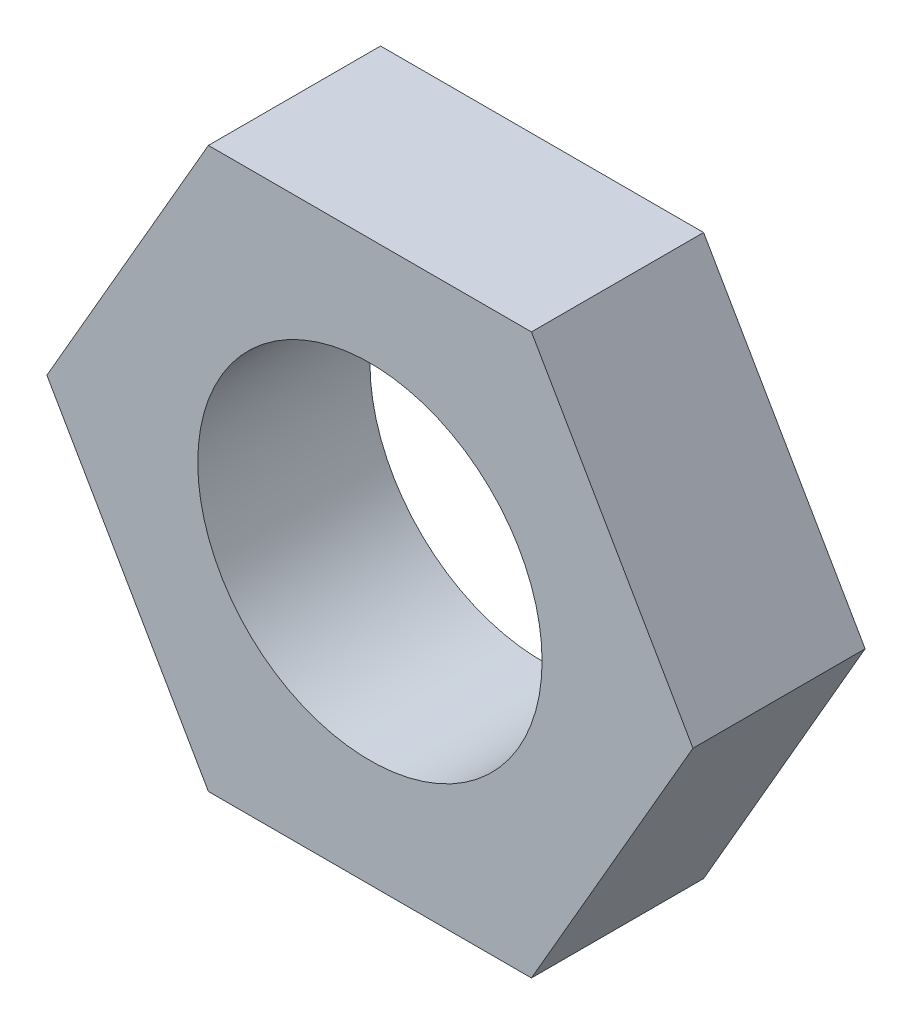
ISO-10303-21;
HEADER;
FILE_DESCRIPTION(('STEP AP214'),'2;1');
FILE_NAME('part.step','',(''),(''),'','','');
FILE_SCHEMA(('AUTOMOTIVE_DESIGN { 1 0 10303 214 1 1 1 1 }'));
ENDSEC;
DATA;
#1=APPLICATION_CONTEXT('core data for automotive mechanical design processes');
#2=APPLICATION_PROTOCOL_DEFINITION('international standard','automotive_design',2000,#1);
#3=PRODUCT_CONTEXT('',#1,'mechanical');
#4=PRODUCT('Part','Part','',(#3));
#5=PRODUCT_RELATED_PRODUCT_CATEGORY('part','',(#4));
#6=PRODUCT_DEFINITION_FORMATION('','',#4);
#7=PRODUCT_DEFINITION_CONTEXT('part definition',#1,'design');
#8=PRODUCT_DEFINITION('design','',#6,#7);
#9=PRODUCT_DEFINITION_SHAPE('','',#8);
#10=(LENGTH_UNIT() NAMED_UNIT(*) SI_UNIT(.MILLI.,.METRE.));
#11=(NAMED_UNIT(*) PLANE_ANGLE_UNIT() SI_UNIT($,.RADIAN.));
#12=(NAMED_UNIT(*) SI_UNIT($,.STERADIAN.) SOLID_ANGLE_UNIT());
#13=UNCERTAINTY_MEASURE_WITH_UNIT(LENGTH_MEASURE(1.E-05),#10,'distance_accuracy_value','');
#14=(GEOMETRIC_REPRESENTATION_CONTEXT(3) GLOBAL_UNCERTAINTY_ASSIGNED_CONTEXT((#13)) GLOBAL_UNIT_ASSIGNED_CONTEXT((#10,
#11,#12)) REPRESENTATION_CONTEXT('',''));
#15=CARTESIAN_POINT('',(0.,0.,0.));
#16=DIRECTION('',(0.,0.,1.));
#17=DIRECTION('',(1.,0.,0.));
#18=AXIS2_PLACEMENT_3D('',#15,#16,#17);
#19=CARTESIAN_POINT('',(0.,0.,-1.));
#20=DIRECTION('',(0.,0.,1.));
#21=DIRECTION('',(1.,0.,0.));
#22=AXIS2_PLACEMENT_3D('',#19,#20,#21);
#23=CYLINDRICAL_SURFACE('',#22,4.);
#24=DIRECTION('',(0.,0.,1.));
#25=VECTOR('',#24,1.);
#26=CARTESIAN_POINT('',(4.,0.,-1.));
#27=LINE('',#26,#25);
#28=CARTESIAN_POINT('',(4.,0.,0.));
#29=VERTEX_POINT('',#28);
#30=CARTESIAN_POINT('',(4.,0.,4.));
#31=VERTEX_POINT('',#30);
#32=EDGE_CURVE('E9',#29,#31,#27,.T.);
#33=ORIENTED_EDGE('',*,*,#32,.F.);
#34=CARTESIAN_POINT('',(0.,0.,0.));
#35=DIRECTION('',(0.,0.,1.));
#36=DIRECTION('',(1.,0.,0.));
#37=AXIS2_PLACEMENT_3D('',#34,#35,#36);
#38=CIRCLE('',#37,4.);
#39=EDGE_CURVE('E83',#29,#29,#38,.T.);
#40=ORIENTED_EDGE('',*,*,#39,.F.);
#41=ORIENTED_EDGE('',*,*,#32,.T.);
#42=CARTESIAN_POINT('',(0.,0.,4.));
#43=DIRECTION('',(0.,0.,1.));
#44=DIRECTION('',(1.,0.,0.));
#45=AXIS2_PLACEMENT_3D('',#42,#43,#44);
#46=CIRCLE('',#45,4.);
#47=EDGE_CURVE('E84',#31,#31,#46,.T.);
#48=ORIENTED_EDGE('',*,*,#47,.T.);
#49=EDGE_LOOP('',(#33,#40,#41,#48));
#50=FACE_BOUND('',#49,.T.);
#51=ADVANCED_FACE('F15',(#50),#23,.F.);
#52=CARTESIAN_POINT('',(-7.505553499465,0.,0.));
#53=DIRECTION('',(0.866025403784329,0.50000000000019,0.));
#54=DIRECTION('',(0.,0.,-1.));
#55=AXIS2_PLACEMENT_3D('',#52,#53,#54);
#56=PLANE('',#55);
#57=DIRECTION('',(0.50000000000019,-0.866025403784329,0.));
#58=VECTOR('',#57,1.);
#59=CARTESIAN_POINT('',(-7.505553499465,0.,0.));
#60=LINE('',#59,#58);
#61=CARTESIAN_POINT('',(-7.505553499465,0.,0.));
#62=VERTEX_POINT('',#61);
#63=CARTESIAN_POINT('',(-3.752776749733,-6.5,0.));
#64=VERTEX_POINT('',#63);
#65=EDGE_CURVE('E101',#62,#64,#60,.T.);
#66=ORIENTED_EDGE('',*,*,#65,.T.);
#67=DIRECTION('',(0.,0.,1.));
#68=VECTOR('',#67,1.);
#69=CARTESIAN_POINT('',(-3.752776749733,-6.5,0.));
#70=LINE('',#69,#68);
#71=CARTESIAN_POINT('',(-3.752776749733,-6.5,4.));
#72=VERTEX_POINT('',#71);
#73=EDGE_CURVE('E108',#64,#72,#70,.T.);
#74=ORIENTED_EDGE('',*,*,#73,.T.);
#75=DIRECTION('',(0.50000000000019,-0.866025403784329,0.));
#76=VECTOR('',#75,1.);
#77=CARTESIAN_POINT('',(-7.505553499465,0.,4.));
#78=LINE('',#77,#76);
#79=CARTESIAN_POINT('',(-7.505553499465,0.,4.));
#80=VERTEX_POINT('',#79);
#81=EDGE_CURVE('E100',#80,#72,#78,.T.);
#82=ORIENTED_EDGE('',*,*,#81,.F.);
#83=DIRECTION('',(0.,0.,1.));
#84=VECTOR('',#83,1.);
#85=CARTESIAN_POINT('',(-7.505553499465,0.,0.));
#86=LINE('',#85,#84);
#87=EDGE_CURVE('E18',#62,#80,#86,.T.);
#88=ORIENTED_EDGE('',*,*,#87,.F.);
#89=EDGE_LOOP('',(#66,#74,#82,#88));
#90=FACE_BOUND('',#89,.T.);
#91=ADVANCED_FACE('F123',(#90),#56,.F.);
#92=CARTESIAN_POINT('',(-3.752776749733,6.5,0.));
#93=DIRECTION('',(0.866025403784329,-0.50000000000019,0.));
#94=DIRECTION('',(0.,0.,-1.));
#95=AXIS2_PLACEMENT_3D('',#92,#93,#94);
#96=PLANE('',#95);
#97=DIRECTION('',(-0.50000000000019,-0.866025403784329,0.));
#98=VECTOR('',#97,1.);
#99=CARTESIAN_POINT('',(-3.752776749733,6.5,0.));
#100=LINE('',#99,#98);
#101=CARTESIAN_POINT('',(-3.752776749733,6.5,0.));
#102=VERTEX_POINT('',#101);
#103=EDGE_CURVE('E93',#102,#62,#100,.T.);
#104=ORIENTED_EDGE('',*,*,#103,.T.);
#105=ORIENTED_EDGE('',*,*,#87,.T.);
#106=DIRECTION('',(-0.50000000000019,-0.866025403784329,0.));
#107=VECTOR('',#106,1.);
#108=CARTESIAN_POINT('',(-3.752776749733,6.5,4.));
#109=LINE('',#108,#107);
#110=CARTESIAN_POINT('',(-3.752776749733,6.5,4.));
#111=VERTEX_POINT('',#110);
#112=EDGE_CURVE('E89',#111,#80,#109,.T.);
#113=ORIENTED_EDGE('',*,*,#112,.F.);
#114=DIRECTION('',(0.,0.,1.));
#115=VECTOR('',#114,1.);
#116=CARTESIAN_POINT('',(-3.752776749733,6.5,0.));
#117=LINE('',#116,#115);
#118=EDGE_CURVE('E139',#102,#111,#117,.T.);
#119=ORIENTED_EDGE('',*,*,#118,.F.);
#120=EDGE_LOOP('',(#104,#105,#113,#119));
#121=FACE_BOUND('',#120,.T.);
#122=ADVANCED_FACE('F120',(#121),#96,.F.);
#123=CARTESIAN_POINT('',(-3.752776749733,-6.5,0.));
#124=DIRECTION('',(0.,1.,0.));
#125=DIRECTION('',(1.,0.,0.));
#126=AXIS2_PLACEMENT_3D('',#123,#124,#125);
#127=PLANE('',#126);
#128=DIRECTION('',(1.,0.,0.));
#129=VECTOR('',#128,1.);
#130=CARTESIAN_POINT('',(-3.752776749733,-6.5,0.));
#131=LINE('',#130,#129);
#132=CARTESIAN_POINT('',(3.752776749733,-6.5,0.));
#133=VERTEX_POINT('',#132);
#134=EDGE_CURVE('E137',#64,#133,#131,.T.);
#135=ORIENTED_EDGE('',*,*,#134,.T.);
#136=DIRECTION('',(0.,0.,1.));
#137=VECTOR('',#136,1.);
#138=CARTESIAN_POINT('',(3.752776749733,-6.5,0.));
#139=LINE('',#138,#137);
#140=CARTESIAN_POINT('',(3.752776749733,-6.5,4.));
#141=VERTEX_POINT('',#140);
#142=EDGE_CURVE('E147',#133,#141,#139,.T.);
#143=ORIENTED_EDGE('',*,*,#142,.T.);
#144=DIRECTION('',(1.,0.,0.));
#145=VECTOR('',#144,1.);
#146=CARTESIAN_POINT('',(-3.752776749733,-6.5,4.));
#147=LINE('',#146,#145);
#148=EDGE_CURVE('E104',#72,#141,#147,.T.);
#149=ORIENTED_EDGE('',*,*,#148,.F.);
#150=ORIENTED_EDGE('',*,*,#73,.F.);
#151=EDGE_LOOP('',(#135,#143,#149,#150));
#152=FACE_BOUND('',#151,.T.);
#153=ADVANCED_FACE('F191',(#152),#127,.F.);
#154=CARTESIAN_POINT('',(0.,0.,4.));
#155=DIRECTION('',(0.,0.,1.));
#156=DIRECTION('',(1.,0.,0.));
#157=AXIS2_PLACEMENT_3D('',#154,#155,#156);
#158=PLANE('',#157);
#159=ORIENTED_EDGE('',*,*,#47,.F.);
#160=EDGE_LOOP('',(#159));
#161=FACE_BOUND('',#160,.T.);
#162=DIRECTION('',(-0.50000000000019,0.866025403784329,0.));
#163=VECTOR('',#162,1.);
#164=CARTESIAN_POINT('',(7.505553499465,0.,4.));
#165=LINE('',#164,#163);
#166=CARTESIAN_POINT('',(7.505553499465,0.,4.));
#167=VERTEX_POINT('',#166);
#168=CARTESIAN_POINT('',(3.752776749733,6.5,4.));
#169=VERTEX_POINT('',#168);
#170=EDGE_CURVE('E133',#167,#169,#165,.T.);
#171=ORIENTED_EDGE('',*,*,#170,.T.);
#172=DIRECTION('',(-1.,0.,0.));
#173=VECTOR('',#172,1.);
#174=CARTESIAN_POINT('',(3.752776749733,6.5,4.));
#175=LINE('',#174,#173);
#176=EDGE_CURVE('E131',#169,#111,#175,.T.);
#177=ORIENTED_EDGE('',*,*,#176,.T.);
#178=ORIENTED_EDGE('',*,*,#112,.T.);
#179=ORIENTED_EDGE('',*,*,#81,.T.);
#180=ORIENTED_EDGE('',*,*,#148,.T.);
#181=DIRECTION('',(0.50000000000019,0.866025403784329,0.));
#182=VECTOR('',#181,1.);
#183=CARTESIAN_POINT('',(3.752776749733,-6.5,4.));
#184=LINE('',#183,#182);
#185=EDGE_CURVE('E172',#141,#167,#184,.T.);
#186=ORIENTED_EDGE('',*,*,#185,.T.);
#187=EDGE_LOOP('',(#171,#177,#178,#179,#180,#186));
#188=FACE_BOUND('',#187,.T.);
#189=ADVANCED_FACE('F129',(#161,#188),#158,.T.);
#190=CARTESIAN_POINT('',(0.,0.,0.));
#191=DIRECTION('',(0.,0.,1.));
#192=DIRECTION('',(1.,0.,0.));
#193=AXIS2_PLACEMENT_3D('',#190,#191,#192);
#194=PLANE('',#193);
#195=ORIENTED_EDGE('',*,*,#39,.T.);
#196=EDGE_LOOP('',(#195));
#197=FACE_BOUND('',#196,.T.);
#198=DIRECTION('',(0.50000000000019,0.866025403784329,0.));
#199=VECTOR('',#198,1.);
#200=CARTESIAN_POINT('',(3.752776749733,-6.5,0.));
#201=LINE('',#200,#199);
#202=CARTESIAN_POINT('',(7.505553499465,0.,0.));
#203=VERTEX_POINT('',#202);
#204=EDGE_CURVE('E164',#133,#203,#201,.T.);
#205=ORIENTED_EDGE('',*,*,#204,.F.);
#206=ORIENTED_EDGE('',*,*,#134,.F.);
#207=ORIENTED_EDGE('',*,*,#65,.F.);
#208=ORIENTED_EDGE('',*,*,#103,.F.);
#209=DIRECTION('',(-1.,0.,0.));
#210=VECTOR('',#209,1.);
#211=CARTESIAN_POINT('',(3.752776749733,6.5,0.));
#212=LINE('',#211,#210);
#213=CARTESIAN_POINT('',(3.752776749733,6.5,0.));
#214=VERTEX_POINT('',#213);
#215=EDGE_CURVE('E145',#214,#102,#212,.T.);
#216=ORIENTED_EDGE('',*,*,#215,.F.);
#217=DIRECTION('',(-0.50000000000019,0.866025403784329,0.));
#218=VECTOR('',#217,1.);
#219=CARTESIAN_POINT('',(7.505553499465,0.,0.));
#220=LINE('',#219,#218);
#221=EDGE_CURVE('E170',#203,#214,#220,.T.);
#222=ORIENTED_EDGE('',*,*,#221,.F.);
#223=EDGE_LOOP('',(#205,#206,#207,#208,#216,#222));
#224=FACE_BOUND('',#223,.T.);
#225=ADVANCED_FACE('F87',(#197,#224),#194,.F.);
#226=CARTESIAN_POINT('',(3.752776749733,6.5,0.));
#227=DIRECTION('',(0.,-1.,0.));
#228=DIRECTION('',(-1.,0.,0.));
#229=AXIS2_PLACEMENT_3D('',#226,#227,#228);
#230=PLANE('',#229);
#231=ORIENTED_EDGE('',*,*,#215,.T.);
#232=ORIENTED_EDGE('',*,*,#118,.T.);
#233=ORIENTED_EDGE('',*,*,#176,.F.);
#234=DIRECTION('',(0.,0.,1.));
#235=VECTOR('',#234,1.);
#236=CARTESIAN_POINT('',(3.752776749733,6.5,0.));
#237=LINE('',#236,#235);
#238=EDGE_CURVE('E181',#214,#169,#237,.T.);
#239=ORIENTED_EDGE('',*,*,#238,.F.);
#240=EDGE_LOOP('',(#231,#232,#233,#239));
#241=FACE_BOUND('',#240,.T.);
#242=ADVANCED_FACE('F141',(#241),#230,.F.);
#243=CARTESIAN_POINT('',(3.752776749733,-6.5,0.));
#244=DIRECTION('',(-0.866025403784329,0.50000000000019,0.));
#245=DIRECTION('',(0.,0.,1.));
#246=AXIS2_PLACEMENT_3D('',#243,#244,#245);
#247=PLANE('',#246);
#248=ORIENTED_EDGE('',*,*,#204,.T.);
#249=DIRECTION('',(0.,0.,1.));
#250=VECTOR('',#249,1.);
#251=CARTESIAN_POINT('',(7.505553499465,0.,0.));
#252=LINE('',#251,#250);
#253=EDGE_CURVE('E174',#203,#167,#252,.T.);
#254=ORIENTED_EDGE('',*,*,#253,.T.);
#255=ORIENTED_EDGE('',*,*,#185,.F.);
#256=ORIENTED_EDGE('',*,*,#142,.F.);
#257=EDGE_LOOP('',(#248,#254,#255,#256));
#258=FACE_BOUND('',#257,.T.);
#259=ADVANCED_FACE('F189',(#258),#247,.F.);
#260=CARTESIAN_POINT('',(7.505553499465,0.,0.));
#261=DIRECTION('',(-0.866025403784329,-0.50000000000019,0.));
#262=DIRECTION('',(-0.50000000000019,0.866025403784329,0.));
#263=AXIS2_PLACEMENT_3D('',#260,#261,#262);
#264=PLANE('',#263);
#265=ORIENTED_EDGE('',*,*,#221,.T.);
#266=ORIENTED_EDGE('',*,*,#238,.T.);
#267=ORIENTED_EDGE('',*,*,#170,.F.);
#268=ORIENTED_EDGE('',*,*,#253,.F.);
#269=EDGE_LOOP('',(#265,#266,#267,#268));
#270=FACE_BOUND('',#269,.T.);
#271=ADVANCED_FACE('F187',(#270),#264,.F.);
#272=CLOSED_SHELL('',(#51,#91,#122,#153,#189,#225,#242,#259,#271));
#273=MANIFOLD_SOLID_BREP('B1',#272);
#274=ADVANCED_BREP_SHAPE_REPRESENTATION('',(#18,#273),#14);
#275=SHAPE_DEFINITION_REPRESENTATION(#9,#274);
ENDSEC;
END-ISO-10303-21;
